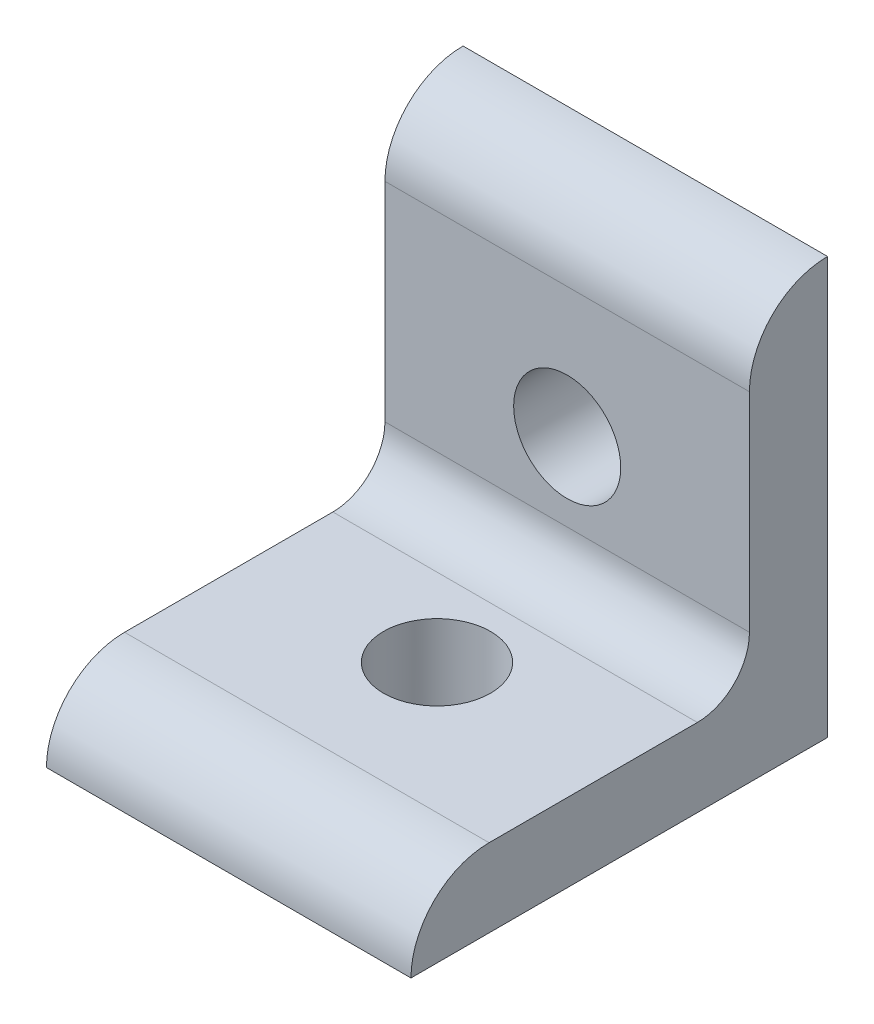
ISO-10303-21;
HEADER;
FILE_DESCRIPTION(('STEP AP214'),'2;1');
FILE_NAME('part.step','',(''),(''),'','','');
FILE_SCHEMA(('AUTOMOTIVE_DESIGN { 1 0 10303 214 1 1 1 1 }'));
ENDSEC;
DATA;
#1=APPLICATION_CONTEXT('core data for automotive mechanical design processes');
#2=APPLICATION_PROTOCOL_DEFINITION('international standard','automotive_design',2000,#1);
#3=PRODUCT_CONTEXT('',#1,'mechanical');
#4=PRODUCT('Part','Part','',(#3));
#5=PRODUCT_RELATED_PRODUCT_CATEGORY('part','',(#4));
#6=PRODUCT_DEFINITION_FORMATION('','',#4);
#7=PRODUCT_DEFINITION_CONTEXT('part definition',#1,'design');
#8=PRODUCT_DEFINITION('design','',#6,#7);
#9=PRODUCT_DEFINITION_SHAPE('','',#8);
#10=(LENGTH_UNIT() NAMED_UNIT(*) SI_UNIT(.MILLI.,.METRE.));
#11=(NAMED_UNIT(*) PLANE_ANGLE_UNIT() SI_UNIT($,.RADIAN.));
#12=(NAMED_UNIT(*) SI_UNIT($,.STERADIAN.) SOLID_ANGLE_UNIT());
#13=UNCERTAINTY_MEASURE_WITH_UNIT(LENGTH_MEASURE(1.E-05),#10,'distance_accuracy_value','');
#14=(GEOMETRIC_REPRESENTATION_CONTEXT(3) GLOBAL_UNCERTAINTY_ASSIGNED_CONTEXT((#13)) GLOBAL_UNIT_ASSIGNED_CONTEXT((#10,
#11,#12)) REPRESENTATION_CONTEXT('',''));
#15=CARTESIAN_POINT('',(0.,0.,0.));
#16=DIRECTION('',(0.,0.,1.));
#17=DIRECTION('',(1.,0.,0.));
#18=AXIS2_PLACEMENT_3D('',#15,#16,#17);
#19=CARTESIAN_POINT('',(-11.1125,7.9375,7.9375));
#20=DIRECTION('',(1.,0.,0.));
#21=DIRECTION('',(0.,0.,-1.));
#22=AXIS2_PLACEMENT_3D('',#19,#20,#21);
#23=CYLINDRICAL_SURFACE('',#22,3.175);
#24=CARTESIAN_POINT('',(11.1125,7.9375,7.9375));
#25=DIRECTION('',(-1.,0.,0.));
#26=DIRECTION('',(0.,0.,-1.));
#27=AXIS2_PLACEMENT_3D('',#24,#25,#26);
#28=CIRCLE('',#27,3.175);
#29=CARTESIAN_POINT('',(11.1125,7.9375,4.7625));
#30=VERTEX_POINT('',#29);
#31=CARTESIAN_POINT('',(11.1125,4.7625,7.9375));
#32=VERTEX_POINT('',#31);
#33=EDGE_CURVE('E91',#30,#32,#28,.T.);
#34=ORIENTED_EDGE('',*,*,#33,.F.);
#35=DIRECTION('',(1.,0.,0.));
#36=VECTOR('',#35,1.);
#37=CARTESIAN_POINT('',(-11.1125,7.9375,4.7625));
#38=LINE('',#37,#36);
#39=CARTESIAN_POINT('',(-11.1125,7.9375,4.7625));
#40=VERTEX_POINT('',#39);
#41=EDGE_CURVE('E11',#40,#30,#38,.T.);
#42=ORIENTED_EDGE('',*,*,#41,.F.);
#43=CARTESIAN_POINT('',(-11.1125,7.9375,7.9375));
#44=DIRECTION('',(-1.,0.,0.));
#45=DIRECTION('',(0.,0.,-1.));
#46=AXIS2_PLACEMENT_3D('',#43,#44,#45);
#47=CIRCLE('',#46,3.175);
#48=CARTESIAN_POINT('',(-11.1125,4.7625,7.9375));
#49=VERTEX_POINT('',#48);
#50=EDGE_CURVE('E93',#40,#49,#47,.T.);
#51=ORIENTED_EDGE('',*,*,#50,.T.);
#52=DIRECTION('',(1.,0.,0.));
#53=VECTOR('',#52,1.);
#54=CARTESIAN_POINT('',(-11.1125,4.7625,7.9375));
#55=LINE('',#54,#53);
#56=EDGE_CURVE('E88',#49,#32,#55,.T.);
#57=ORIENTED_EDGE('',*,*,#56,.T.);
#58=EDGE_LOOP('',(#34,#42,#51,#57));
#59=FACE_BOUND('',#58,.T.);
#60=ADVANCED_FACE('F32',(#59),#23,.F.);
#61=CARTESIAN_POINT('',(-11.1125,7.9375,4.7625));
#62=DIRECTION('',(0.,0.,1.));
#63=DIRECTION('',(0.,-1.,0.));
#64=AXIS2_PLACEMENT_3D('',#61,#62,#63);
#65=PLANE('',#64);
#66=CARTESIAN_POINT('',(0.,12.7,4.7625));
#67=DIRECTION('',(0.,0.,1.));
#68=DIRECTION('',(0.,-1.,0.));
#69=AXIS2_PLACEMENT_3D('',#66,#67,#68);
#70=CIRCLE('',#69,3.2639);
#71=CARTESIAN_POINT('',(0.,9.43609999999999,4.7625));
#72=VERTEX_POINT('',#71);
#73=EDGE_CURVE('E200',#72,#72,#70,.T.);
#74=ORIENTED_EDGE('',*,*,#73,.F.);
#75=EDGE_LOOP('',(#74));
#76=FACE_BOUND('',#75,.T.);
#77=DIRECTION('',(0.,-1.,0.));
#78=VECTOR('',#77,1.);
#79=CARTESIAN_POINT('',(11.1125,7.9375,4.7625));
#80=LINE('',#79,#78);
#81=CARTESIAN_POINT('',(11.1125,20.6375,4.7625));
#82=VERTEX_POINT('',#81);
#83=EDGE_CURVE('E109',#82,#30,#80,.T.);
#84=ORIENTED_EDGE('',*,*,#83,.F.);
#85=DIRECTION('',(1.,0.,0.));
#86=VECTOR('',#85,1.);
#87=CARTESIAN_POINT('',(-11.1125,20.6375,4.7625));
#88=LINE('',#87,#86);
#89=CARTESIAN_POINT('',(-11.1125,20.6375,4.7625));
#90=VERTEX_POINT('',#89);
#91=EDGE_CURVE('E40',#90,#82,#88,.T.);
#92=ORIENTED_EDGE('',*,*,#91,.F.);
#93=DIRECTION('',(0.,-1.,0.));
#94=VECTOR('',#93,1.);
#95=CARTESIAN_POINT('',(-11.1125,7.9375,4.7625));
#96=LINE('',#95,#94);
#97=EDGE_CURVE('E98',#90,#40,#96,.T.);
#98=ORIENTED_EDGE('',*,*,#97,.T.);
#99=ORIENTED_EDGE('',*,*,#41,.T.);
#100=EDGE_LOOP('',(#84,#92,#98,#99));
#101=FACE_BOUND('',#100,.T.);
#102=ADVANCED_FACE('F166',(#76,#101),#65,.T.);
#103=CARTESIAN_POINT('',(-11.1125,20.6375,0.));
#104=DIRECTION('',(1.,0.,0.));
#105=DIRECTION('',(0.,0.,-1.));
#106=AXIS2_PLACEMENT_3D('',#103,#104,#105);
#107=CYLINDRICAL_SURFACE('',#106,4.7625);
#108=CARTESIAN_POINT('',(11.1125,20.6375,0.));
#109=DIRECTION('',(1.,0.,0.));
#110=DIRECTION('',(0.,0.,-1.));
#111=AXIS2_PLACEMENT_3D('',#108,#109,#110);
#112=CIRCLE('',#111,4.7625);
#113=CARTESIAN_POINT('',(11.1125,25.4,0.));
#114=VERTEX_POINT('',#113);
#115=EDGE_CURVE('E123',#114,#82,#112,.T.);
#116=ORIENTED_EDGE('',*,*,#115,.F.);
#117=DIRECTION('',(1.,0.,0.));
#118=VECTOR('',#117,1.);
#119=CARTESIAN_POINT('',(-11.1125,25.4,0.));
#120=LINE('',#119,#118);
#121=CARTESIAN_POINT('',(-11.1125,25.4,0.));
#122=VERTEX_POINT('',#121);
#123=EDGE_CURVE('E142',#122,#114,#120,.T.);
#124=ORIENTED_EDGE('',*,*,#123,.F.);
#125=CARTESIAN_POINT('',(-11.1125,20.6375,0.));
#126=DIRECTION('',(1.,0.,0.));
#127=DIRECTION('',(0.,0.,-1.));
#128=AXIS2_PLACEMENT_3D('',#125,#126,#127);
#129=CIRCLE('',#128,4.7625);
#130=EDGE_CURVE('E138',#122,#90,#129,.T.);
#131=ORIENTED_EDGE('',*,*,#130,.T.);
#132=ORIENTED_EDGE('',*,*,#91,.T.);
#133=EDGE_LOOP('',(#116,#124,#131,#132));
#134=FACE_BOUND('',#133,.T.);
#135=ADVANCED_FACE('F162',(#134),#107,.T.);
#136=CARTESIAN_POINT('',(-11.1125,0.,0.));
#137=DIRECTION('',(0.,0.,-1.));
#138=DIRECTION('',(0.,1.,0.));
#139=AXIS2_PLACEMENT_3D('',#136,#137,#138);
#140=PLANE('',#139);
#141=CARTESIAN_POINT('',(0.,12.7,0.));
#142=DIRECTION('',(0.,0.,-1.));
#143=DIRECTION('',(0.,1.,0.));
#144=AXIS2_PLACEMENT_3D('',#141,#142,#143);
#145=CIRCLE('',#144,3.2639);
#146=CARTESIAN_POINT('',(0.,15.9639,0.));
#147=VERTEX_POINT('',#146);
#148=EDGE_CURVE('E202',#147,#147,#145,.T.);
#149=ORIENTED_EDGE('',*,*,#148,.F.);
#150=EDGE_LOOP('',(#149));
#151=FACE_BOUND('',#150,.T.);
#152=DIRECTION('',(0.,1.,0.));
#153=VECTOR('',#152,1.);
#154=CARTESIAN_POINT('',(11.1125,0.,0.));
#155=LINE('',#154,#153);
#156=CARTESIAN_POINT('',(11.1125,0.,0.));
#157=VERTEX_POINT('',#156);
#158=EDGE_CURVE('E120',#157,#114,#155,.T.);
#159=ORIENTED_EDGE('',*,*,#158,.F.);
#160=DIRECTION('',(1.,0.,0.));
#161=VECTOR('',#160,1.);
#162=CARTESIAN_POINT('',(-11.1125,0.,0.));
#163=LINE('',#162,#161);
#164=CARTESIAN_POINT('',(-11.1125,0.,0.));
#165=VERTEX_POINT('',#164);
#166=EDGE_CURVE('E144',#165,#157,#163,.T.);
#167=ORIENTED_EDGE('',*,*,#166,.F.);
#168=DIRECTION('',(0.,1.,0.));
#169=VECTOR('',#168,1.);
#170=CARTESIAN_POINT('',(-11.1125,0.,0.));
#171=LINE('',#170,#169);
#172=EDGE_CURVE('E135',#165,#122,#171,.T.);
#173=ORIENTED_EDGE('',*,*,#172,.T.);
#174=ORIENTED_EDGE('',*,*,#123,.T.);
#175=EDGE_LOOP('',(#159,#167,#173,#174));
#176=FACE_BOUND('',#175,.T.);
#177=ADVANCED_FACE('F158',(#151,#176),#140,.T.);
#178=CARTESIAN_POINT('',(-11.1125,0.,25.4));
#179=DIRECTION('',(0.,-1.,0.));
#180=DIRECTION('',(0.,0.,-1.));
#181=AXIS2_PLACEMENT_3D('',#178,#179,#180);
#182=PLANE('',#181);
#183=CARTESIAN_POINT('',(0.,0.,12.7));
#184=DIRECTION('',(0.,-1.,0.));
#185=DIRECTION('',(0.,0.,-1.));
#186=AXIS2_PLACEMENT_3D('',#183,#184,#185);
#187=CIRCLE('',#186,3.2639);
#188=CARTESIAN_POINT('',(0.,0.,9.4361));
#189=VERTEX_POINT('',#188);
#190=EDGE_CURVE('E112',#189,#189,#187,.T.);
#191=ORIENTED_EDGE('',*,*,#190,.F.);
#192=EDGE_LOOP('',(#191));
#193=FACE_BOUND('',#192,.T.);
#194=DIRECTION('',(0.,0.,-1.));
#195=VECTOR('',#194,1.);
#196=CARTESIAN_POINT('',(11.1125,0.,25.4));
#197=LINE('',#196,#195);
#198=CARTESIAN_POINT('',(11.1125,0.,25.4));
#199=VERTEX_POINT('',#198);
#200=EDGE_CURVE('E117',#199,#157,#197,.T.);
#201=ORIENTED_EDGE('',*,*,#200,.F.);
#202=DIRECTION('',(1.,0.,0.));
#203=VECTOR('',#202,1.);
#204=CARTESIAN_POINT('',(-11.1125,0.,25.4));
#205=LINE('',#204,#203);
#206=CARTESIAN_POINT('',(-11.1125,0.,25.4));
#207=VERTEX_POINT('',#206);
#208=EDGE_CURVE('E146',#207,#199,#205,.T.);
#209=ORIENTED_EDGE('',*,*,#208,.F.);
#210=DIRECTION('',(0.,0.,-1.));
#211=VECTOR('',#210,1.);
#212=CARTESIAN_POINT('',(-11.1125,0.,25.4));
#213=LINE('',#212,#211);
#214=EDGE_CURVE('E132',#207,#165,#213,.T.);
#215=ORIENTED_EDGE('',*,*,#214,.T.);
#216=ORIENTED_EDGE('',*,*,#166,.T.);
#217=EDGE_LOOP('',(#201,#209,#215,#216));
#218=FACE_BOUND('',#217,.T.);
#219=ADVANCED_FACE('F154',(#193,#218),#182,.T.);
#220=CARTESIAN_POINT('',(-11.1125,0.,20.6375));
#221=DIRECTION('',(1.,0.,0.));
#222=DIRECTION('',(0.,0.,-1.));
#223=AXIS2_PLACEMENT_3D('',#220,#221,#222);
#224=CYLINDRICAL_SURFACE('',#223,4.7625);
#225=CARTESIAN_POINT('',(11.1125,0.,20.6375));
#226=DIRECTION('',(1.,0.,0.));
#227=DIRECTION('',(0.,0.,-1.));
#228=AXIS2_PLACEMENT_3D('',#225,#226,#227);
#229=CIRCLE('',#228,4.7625);
#230=CARTESIAN_POINT('',(11.1125,4.7625,20.6375));
#231=VERTEX_POINT('',#230);
#232=EDGE_CURVE('E105',#231,#199,#229,.T.);
#233=ORIENTED_EDGE('',*,*,#232,.F.);
#234=DIRECTION('',(1.,0.,0.));
#235=VECTOR('',#234,1.);
#236=CARTESIAN_POINT('',(-11.1125,4.7625,20.6375));
#237=LINE('',#236,#235);
#238=CARTESIAN_POINT('',(-11.1125,4.7625,20.6375));
#239=VERTEX_POINT('',#238);
#240=EDGE_CURVE('E97',#239,#231,#237,.T.);
#241=ORIENTED_EDGE('',*,*,#240,.F.);
#242=CARTESIAN_POINT('',(-11.1125,0.,20.6375));
#243=DIRECTION('',(1.,0.,0.));
#244=DIRECTION('',(0.,0.,-1.));
#245=AXIS2_PLACEMENT_3D('',#242,#243,#244);
#246=CIRCLE('',#245,4.7625);
#247=EDGE_CURVE('E129',#239,#207,#246,.T.);
#248=ORIENTED_EDGE('',*,*,#247,.T.);
#249=ORIENTED_EDGE('',*,*,#208,.T.);
#250=EDGE_LOOP('',(#233,#241,#248,#249));
#251=FACE_BOUND('',#250,.T.);
#252=ADVANCED_FACE('F150',(#251),#224,.T.);
#253=CARTESIAN_POINT('',(-11.1125,4.7625,20.6375));
#254=DIRECTION('',(0.,1.,0.));
#255=DIRECTION('',(0.,0.,1.));
#256=AXIS2_PLACEMENT_3D('',#253,#254,#255);
#257=PLANE('',#256);
#258=CARTESIAN_POINT('',(0.,4.7625,12.7));
#259=DIRECTION('',(0.,1.,0.));
#260=DIRECTION('',(0.,0.,1.));
#261=AXIS2_PLACEMENT_3D('',#258,#259,#260);
#262=CIRCLE('',#261,3.2639);
#263=CARTESIAN_POINT('',(0.,4.7625,15.9639));
#264=VERTEX_POINT('',#263);
#265=EDGE_CURVE('E35',#264,#264,#262,.T.);
#266=ORIENTED_EDGE('',*,*,#265,.F.);
#267=EDGE_LOOP('',(#266));
#268=FACE_BOUND('',#267,.T.);
#269=DIRECTION('',(0.,0.,1.));
#270=VECTOR('',#269,1.);
#271=CARTESIAN_POINT('',(11.1125,4.7625,20.6375));
#272=LINE('',#271,#270);
#273=EDGE_CURVE('E100',#32,#231,#272,.T.);
#274=ORIENTED_EDGE('',*,*,#273,.F.);
#275=ORIENTED_EDGE('',*,*,#56,.F.);
#276=DIRECTION('',(0.,0.,1.));
#277=VECTOR('',#276,1.);
#278=CARTESIAN_POINT('',(-11.1125,4.7625,20.6375));
#279=LINE('',#278,#277);
#280=EDGE_CURVE('E127',#49,#239,#279,.T.);
#281=ORIENTED_EDGE('',*,*,#280,.T.);
#282=ORIENTED_EDGE('',*,*,#240,.T.);
#283=EDGE_LOOP('',(#274,#275,#281,#282));
#284=FACE_BOUND('',#283,.T.);
#285=ADVANCED_FACE('F101',(#268,#284),#257,.T.);
#286=CARTESIAN_POINT('',(-11.1125,7.9375,7.9375));
#287=DIRECTION('',(1.,0.,0.));
#288=DIRECTION('',(0.,0.,-1.));
#289=AXIS2_PLACEMENT_3D('',#286,#287,#288);
#290=PLANE('',#289);
#291=ORIENTED_EDGE('',*,*,#50,.F.);
#292=ORIENTED_EDGE('',*,*,#97,.F.);
#293=ORIENTED_EDGE('',*,*,#130,.F.);
#294=ORIENTED_EDGE('',*,*,#172,.F.);
#295=ORIENTED_EDGE('',*,*,#214,.F.);
#296=ORIENTED_EDGE('',*,*,#247,.F.);
#297=ORIENTED_EDGE('',*,*,#280,.F.);
#298=EDGE_LOOP('',(#291,#292,#293,#294,#295,#296,#297));
#299=FACE_BOUND('',#298,.T.);
#300=ADVANCED_FACE('F165',(#299),#290,.F.);
#301=CARTESIAN_POINT('',(11.1125,7.9375,7.9375));
#302=DIRECTION('',(1.,0.,0.));
#303=DIRECTION('',(0.,0.,-1.));
#304=AXIS2_PLACEMENT_3D('',#301,#302,#303);
#305=PLANE('',#304);
#306=ORIENTED_EDGE('',*,*,#33,.T.);
#307=ORIENTED_EDGE('',*,*,#273,.T.);
#308=ORIENTED_EDGE('',*,*,#232,.T.);
#309=ORIENTED_EDGE('',*,*,#200,.T.);
#310=ORIENTED_EDGE('',*,*,#158,.T.);
#311=ORIENTED_EDGE('',*,*,#115,.T.);
#312=ORIENTED_EDGE('',*,*,#83,.T.);
#313=EDGE_LOOP('',(#306,#307,#308,#309,#310,#311,#312));
#314=FACE_BOUND('',#313,.T.);
#315=ADVANCED_FACE('F107',(#314),#305,.T.);
#316=CARTESIAN_POINT('',(0.,25.4,12.7));
#317=DIRECTION('',(0.,-1.,0.));
#318=DIRECTION('',(0.,0.,-1.));
#319=AXIS2_PLACEMENT_3D('',#316,#317,#318);
#320=CYLINDRICAL_SURFACE('',#319,3.2639);
#321=ORIENTED_EDGE('',*,*,#265,.T.);
#322=EDGE_LOOP('',(#321));
#323=FACE_BOUND('',#322,.T.);
#324=ORIENTED_EDGE('',*,*,#190,.T.);
#325=EDGE_LOOP('',(#324));
#326=FACE_BOUND('',#325,.T.);
#327=ADVANCED_FACE('F193',(#323,#326),#320,.F.);
#328=CARTESIAN_POINT('',(0.,12.7,25.4));
#329=DIRECTION('',(0.,0.,-1.));
#330=DIRECTION('',(0.,1.,0.));
#331=AXIS2_PLACEMENT_3D('',#328,#329,#330);
#332=CYLINDRICAL_SURFACE('',#331,3.2639);
#333=ORIENTED_EDGE('',*,*,#73,.T.);
#334=EDGE_LOOP('',(#333));
#335=FACE_BOUND('',#334,.T.);
#336=ORIENTED_EDGE('',*,*,#148,.T.);
#337=EDGE_LOOP('',(#336));
#338=FACE_BOUND('',#337,.T.);
#339=ADVANCED_FACE('F196',(#335,#338),#332,.F.);
#340=CLOSED_SHELL('',(#60,#102,#135,#177,#219,#252,#285,#300,#315,#327,#339));
#341=MANIFOLD_SOLID_BREP('B2',#340);
#342=ADVANCED_BREP_SHAPE_REPRESENTATION('',(#18,#341),#14);
#343=SHAPE_DEFINITION_REPRESENTATION(#9,#342);
ENDSEC;
END-ISO-10303-21;
